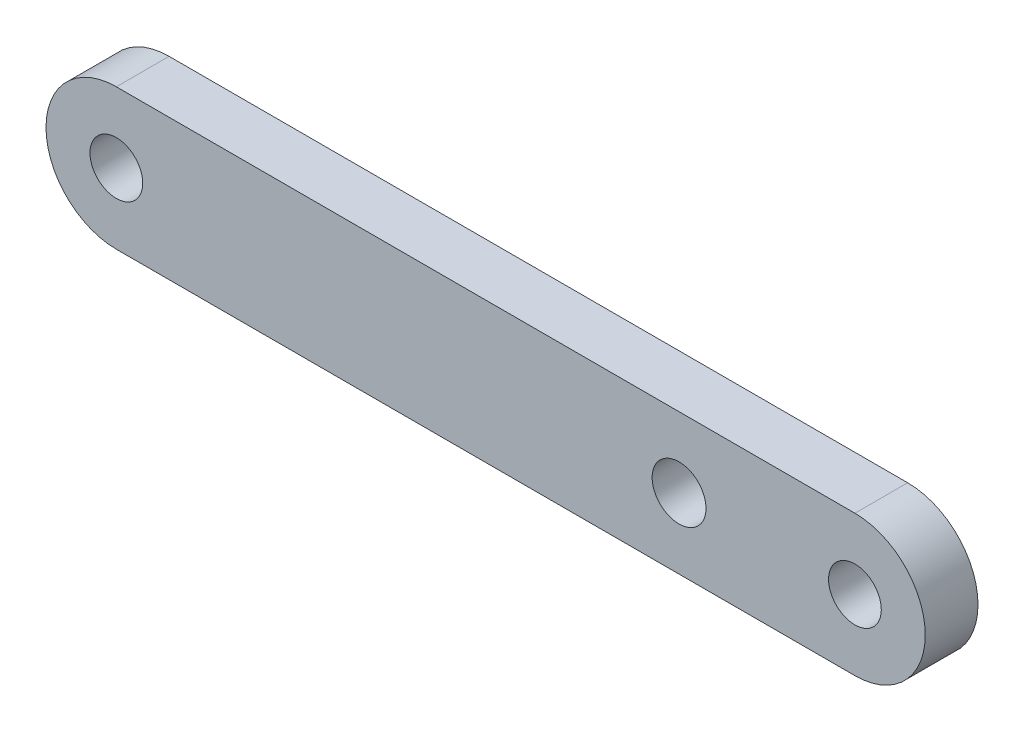
ISO-10303-21;
HEADER;
FILE_DESCRIPTION(('STEP AP214'),'2;1');
FILE_NAME('part.step','',(''),(''),'','','');
FILE_SCHEMA(('AUTOMOTIVE_DESIGN { 1 0 10303 214 1 1 1 1 }'));
ENDSEC;
DATA;
#1=APPLICATION_CONTEXT('core data for automotive mechanical design processes');
#2=APPLICATION_PROTOCOL_DEFINITION('international standard','automotive_design',2000,#1);
#3=PRODUCT_CONTEXT('',#1,'mechanical');
#4=PRODUCT('Part','Part','',(#3));
#5=PRODUCT_RELATED_PRODUCT_CATEGORY('part','',(#4));
#6=PRODUCT_DEFINITION_FORMATION('','',#4);
#7=PRODUCT_DEFINITION_CONTEXT('part definition',#1,'design');
#8=PRODUCT_DEFINITION('design','',#6,#7);
#9=PRODUCT_DEFINITION_SHAPE('','',#8);
#10=(LENGTH_UNIT() NAMED_UNIT(*) SI_UNIT(.MILLI.,.METRE.));
#11=(NAMED_UNIT(*) PLANE_ANGLE_UNIT() SI_UNIT($,.RADIAN.));
#12=(NAMED_UNIT(*) SI_UNIT($,.STERADIAN.) SOLID_ANGLE_UNIT());
#13=UNCERTAINTY_MEASURE_WITH_UNIT(LENGTH_MEASURE(1.E-05),#10,'distance_accuracy_value','');
#14=(GEOMETRIC_REPRESENTATION_CONTEXT(3) GLOBAL_UNCERTAINTY_ASSIGNED_CONTEXT((#13)) GLOBAL_UNIT_ASSIGNED_CONTEXT((#10,
#11,#12)) REPRESENTATION_CONTEXT('',''));
#15=CARTESIAN_POINT('',(0.,0.,0.));
#16=DIRECTION('',(0.,0.,1.));
#17=DIRECTION('',(1.,0.,0.));
#18=AXIS2_PLACEMENT_3D('',#15,#16,#17);
#19=CARTESIAN_POINT('',(-105.,0.,15.));
#20=DIRECTION('',(0.,0.,-1.));
#21=DIRECTION('',(-1.,0.,0.));
#22=AXIS2_PLACEMENT_3D('',#19,#20,#21);
#23=CYLINDRICAL_SURFACE('',#22,20.);
#24=CARTESIAN_POINT('',(-105.,0.,0.));
#25=DIRECTION('',(0.,0.,1.));
#26=DIRECTION('',(1.,0.,0.));
#27=AXIS2_PLACEMENT_3D('',#24,#25,#26);
#28=CIRCLE('',#27,20.);
#29=CARTESIAN_POINT('',(-105.,20.,0.));
#30=VERTEX_POINT('',#29);
#31=CARTESIAN_POINT('',(-105.,-20.,0.));
#32=VERTEX_POINT('',#31);
#33=EDGE_CURVE('E109',#30,#32,#28,.T.);
#34=ORIENTED_EDGE('',*,*,#33,.T.);
#35=DIRECTION('',(0.,0.,-1.));
#36=VECTOR('',#35,1.);
#37=CARTESIAN_POINT('',(-105.,-20.,15.));
#38=LINE('',#37,#36);
#39=CARTESIAN_POINT('',(-105.,-20.,15.));
#40=VERTEX_POINT('',#39);
#41=EDGE_CURVE('E11',#40,#32,#38,.T.);
#42=ORIENTED_EDGE('',*,*,#41,.F.);
#43=CARTESIAN_POINT('',(-105.,0.,15.));
#44=DIRECTION('',(0.,0.,1.));
#45=DIRECTION('',(1.,0.,0.));
#46=AXIS2_PLACEMENT_3D('',#43,#44,#45);
#47=CIRCLE('',#46,20.);
#48=CARTESIAN_POINT('',(-105.,20.,15.));
#49=VERTEX_POINT('',#48);
#50=EDGE_CURVE('E93',#49,#40,#47,.T.);
#51=ORIENTED_EDGE('',*,*,#50,.F.);
#52=DIRECTION('',(0.,0.,-1.));
#53=VECTOR('',#52,1.);
#54=CARTESIAN_POINT('',(-105.,20.,15.));
#55=LINE('',#54,#53);
#56=EDGE_CURVE('E105',#49,#30,#55,.T.);
#57=ORIENTED_EDGE('',*,*,#56,.T.);
#58=EDGE_LOOP('',(#34,#42,#51,#57));
#59=FACE_BOUND('',#58,.T.);
#60=ADVANCED_FACE('F41',(#59),#23,.T.);
#61=CARTESIAN_POINT('',(-105.,-20.,15.));
#62=DIRECTION('',(0.,1.,0.));
#63=DIRECTION('',(0.,0.,1.));
#64=AXIS2_PLACEMENT_3D('',#61,#62,#63);
#65=PLANE('',#64);
#66=DIRECTION('',(1.,0.,0.));
#67=VECTOR('',#66,1.);
#68=CARTESIAN_POINT('',(-105.,-20.,0.));
#69=LINE('',#68,#67);
#70=CARTESIAN_POINT('',(105.,-20.,0.));
#71=VERTEX_POINT('',#70);
#72=EDGE_CURVE('E98',#32,#71,#69,.T.);
#73=ORIENTED_EDGE('',*,*,#72,.T.);
#74=DIRECTION('',(0.,0.,-1.));
#75=VECTOR('',#74,1.);
#76=CARTESIAN_POINT('',(105.,-20.,15.));
#77=LINE('',#76,#75);
#78=CARTESIAN_POINT('',(105.,-20.,15.));
#79=VERTEX_POINT('',#78);
#80=EDGE_CURVE('E50',#79,#71,#77,.T.);
#81=ORIENTED_EDGE('',*,*,#80,.F.);
#82=DIRECTION('',(1.,0.,0.));
#83=VECTOR('',#82,1.);
#84=CARTESIAN_POINT('',(-105.,-20.,15.));
#85=LINE('',#84,#83);
#86=EDGE_CURVE('E88',#40,#79,#85,.T.);
#87=ORIENTED_EDGE('',*,*,#86,.F.);
#88=ORIENTED_EDGE('',*,*,#41,.T.);
#89=EDGE_LOOP('',(#73,#81,#87,#88));
#90=FACE_BOUND('',#89,.T.);
#91=ADVANCED_FACE('F97',(#90),#65,.F.);
#92=CARTESIAN_POINT('',(105.,0.,15.));
#93=DIRECTION('',(0.,0.,-1.));
#94=DIRECTION('',(-1.,0.,0.));
#95=AXIS2_PLACEMENT_3D('',#92,#93,#94);
#96=CYLINDRICAL_SURFACE('',#95,20.);
#97=CARTESIAN_POINT('',(105.,0.,0.));
#98=DIRECTION('',(0.,0.,1.));
#99=DIRECTION('',(-1.,0.,0.));
#100=AXIS2_PLACEMENT_3D('',#97,#98,#99);
#101=CIRCLE('',#100,20.);
#102=CARTESIAN_POINT('',(105.,20.,0.));
#103=VERTEX_POINT('',#102);
#104=EDGE_CURVE('E75',#71,#103,#101,.T.);
#105=ORIENTED_EDGE('',*,*,#104,.T.);
#106=DIRECTION('',(0.,0.,-1.));
#107=VECTOR('',#106,1.);
#108=CARTESIAN_POINT('',(105.,20.,15.));
#109=LINE('',#108,#107);
#110=CARTESIAN_POINT('',(105.,20.,15.));
#111=VERTEX_POINT('',#110);
#112=EDGE_CURVE('E100',#111,#103,#109,.T.);
#113=ORIENTED_EDGE('',*,*,#112,.F.);
#114=CARTESIAN_POINT('',(105.,0.,15.));
#115=DIRECTION('',(0.,0.,1.));
#116=DIRECTION('',(-1.,0.,0.));
#117=AXIS2_PLACEMENT_3D('',#114,#115,#116);
#118=CIRCLE('',#117,20.);
#119=EDGE_CURVE('E91',#79,#111,#118,.T.);
#120=ORIENTED_EDGE('',*,*,#119,.F.);
#121=ORIENTED_EDGE('',*,*,#80,.T.);
#122=EDGE_LOOP('',(#105,#113,#120,#121));
#123=FACE_BOUND('',#122,.T.);
#124=ADVANCED_FACE('F101',(#123),#96,.T.);
#125=CARTESIAN_POINT('',(-105.,20.,15.));
#126=DIRECTION('',(0.,-1.,0.));
#127=DIRECTION('',(0.,0.,-1.));
#128=AXIS2_PLACEMENT_3D('',#125,#126,#127);
#129=PLANE('',#128);
#130=DIRECTION('',(-1.,0.,0.));
#131=VECTOR('',#130,1.);
#132=CARTESIAN_POINT('',(-105.,20.,0.));
#133=LINE('',#132,#131);
#134=EDGE_CURVE('E81',#103,#30,#133,.T.);
#135=ORIENTED_EDGE('',*,*,#134,.T.);
#136=ORIENTED_EDGE('',*,*,#56,.F.);
#137=DIRECTION('',(-1.,0.,0.));
#138=VECTOR('',#137,1.);
#139=CARTESIAN_POINT('',(-105.,20.,15.));
#140=LINE('',#139,#138);
#141=EDGE_CURVE('E58',#111,#49,#140,.T.);
#142=ORIENTED_EDGE('',*,*,#141,.F.);
#143=ORIENTED_EDGE('',*,*,#112,.T.);
#144=EDGE_LOOP('',(#135,#136,#142,#143));
#145=FACE_BOUND('',#144,.T.);
#146=ADVANCED_FACE('F123',(#145),#129,.F.);
#147=CARTESIAN_POINT('',(-105.,0.,15.));
#148=DIRECTION('',(0.,0.,1.));
#149=DIRECTION('',(1.,0.,0.));
#150=AXIS2_PLACEMENT_3D('',#147,#148,#149);
#151=PLANE('',#150);
#152=CARTESIAN_POINT('',(55.,0.,15.));
#153=DIRECTION('',(0.,0.,1.));
#154=DIRECTION('',(1.,0.,0.));
#155=AXIS2_PLACEMENT_3D('',#152,#153,#154);
#156=CIRCLE('',#155,7.6562877612867);
#157=CARTESIAN_POINT('',(62.6562877612867,0.,15.));
#158=VERTEX_POINT('',#157);
#159=EDGE_CURVE('E146',#158,#158,#156,.T.);
#160=ORIENTED_EDGE('',*,*,#159,.F.);
#161=EDGE_LOOP('',(#160));
#162=FACE_BOUND('',#161,.T.);
#163=CARTESIAN_POINT('',(-105.,0.,15.));
#164=DIRECTION('',(0.,0.,-1.));
#165=DIRECTION('',(-1.,0.,0.));
#166=AXIS2_PLACEMENT_3D('',#163,#164,#165);
#167=CIRCLE('',#166,7.5);
#168=CARTESIAN_POINT('',(-112.5,0.,15.));
#169=VERTEX_POINT('',#168);
#170=EDGE_CURVE('E138',#169,#169,#167,.T.);
#171=ORIENTED_EDGE('',*,*,#170,.T.);
#172=EDGE_LOOP('',(#171));
#173=FACE_BOUND('',#172,.T.);
#174=CARTESIAN_POINT('',(105.,0.,15.));
#175=DIRECTION('',(0.,0.,1.));
#176=DIRECTION('',(1.,0.,0.));
#177=AXIS2_PLACEMENT_3D('',#174,#175,#176);
#178=CIRCLE('',#177,7.5);
#179=CARTESIAN_POINT('',(112.5,0.,15.));
#180=VERTEX_POINT('',#179);
#181=EDGE_CURVE('E130',#180,#180,#178,.T.);
#182=ORIENTED_EDGE('',*,*,#181,.F.);
#183=EDGE_LOOP('',(#182));
#184=FACE_BOUND('',#183,.T.);
#185=ORIENTED_EDGE('',*,*,#50,.T.);
#186=ORIENTED_EDGE('',*,*,#86,.T.);
#187=ORIENTED_EDGE('',*,*,#119,.T.);
#188=ORIENTED_EDGE('',*,*,#141,.T.);
#189=EDGE_LOOP('',(#185,#186,#187,#188));
#190=FACE_BOUND('',#189,.T.);
#191=ADVANCED_FACE('F89',(#162,#173,#184,#190),#151,.T.);
#192=CARTESIAN_POINT('',(-105.,0.,0.));
#193=DIRECTION('',(0.,0.,1.));
#194=DIRECTION('',(1.,0.,0.));
#195=AXIS2_PLACEMENT_3D('',#192,#193,#194);
#196=PLANE('',#195);
#197=CARTESIAN_POINT('',(55.,0.,0.));
#198=DIRECTION('',(0.,0.,1.));
#199=DIRECTION('',(1.,0.,0.));
#200=AXIS2_PLACEMENT_3D('',#197,#198,#199);
#201=CIRCLE('',#200,7.6562877612867);
#202=CARTESIAN_POINT('',(62.6562877612867,0.,0.));
#203=VERTEX_POINT('',#202);
#204=EDGE_CURVE('E142',#203,#203,#201,.T.);
#205=ORIENTED_EDGE('',*,*,#204,.T.);
#206=EDGE_LOOP('',(#205));
#207=FACE_BOUND('',#206,.T.);
#208=CARTESIAN_POINT('',(-105.,0.,0.));
#209=DIRECTION('',(0.,0.,-1.));
#210=DIRECTION('',(-1.,0.,0.));
#211=AXIS2_PLACEMENT_3D('',#208,#209,#210);
#212=CIRCLE('',#211,7.5);
#213=CARTESIAN_POINT('',(-112.5,0.,0.));
#214=VERTEX_POINT('',#213);
#215=EDGE_CURVE('E134',#214,#214,#212,.T.);
#216=ORIENTED_EDGE('',*,*,#215,.F.);
#217=EDGE_LOOP('',(#216));
#218=FACE_BOUND('',#217,.T.);
#219=CARTESIAN_POINT('',(105.,0.,0.));
#220=DIRECTION('',(0.,0.,1.));
#221=DIRECTION('',(1.,0.,0.));
#222=AXIS2_PLACEMENT_3D('',#219,#220,#221);
#223=CIRCLE('',#222,7.5);
#224=CARTESIAN_POINT('',(112.5,0.,0.));
#225=VERTEX_POINT('',#224);
#226=EDGE_CURVE('E113',#225,#225,#223,.T.);
#227=ORIENTED_EDGE('',*,*,#226,.T.);
#228=EDGE_LOOP('',(#227));
#229=FACE_BOUND('',#228,.T.);
#230=ORIENTED_EDGE('',*,*,#33,.F.);
#231=ORIENTED_EDGE('',*,*,#134,.F.);
#232=ORIENTED_EDGE('',*,*,#104,.F.);
#233=ORIENTED_EDGE('',*,*,#72,.F.);
#234=EDGE_LOOP('',(#230,#231,#232,#233));
#235=FACE_BOUND('',#234,.T.);
#236=ADVANCED_FACE('F126',(#207,#218,#229,#235),#196,.F.);
#237=CARTESIAN_POINT('',(105.,0.,0.));
#238=DIRECTION('',(0.,0.,1.));
#239=DIRECTION('',(1.,0.,0.));
#240=AXIS2_PLACEMENT_3D('',#237,#238,#239);
#241=CYLINDRICAL_SURFACE('',#240,7.5);
#242=ORIENTED_EDGE('',*,*,#226,.F.);
#243=EDGE_LOOP('',(#242));
#244=FACE_BOUND('',#243,.T.);
#245=ORIENTED_EDGE('',*,*,#181,.T.);
#246=EDGE_LOOP('',(#245));
#247=FACE_BOUND('',#246,.T.);
#248=ADVANCED_FACE('F170',(#244,#247),#241,.F.);
#249=CARTESIAN_POINT('',(-105.,0.,0.));
#250=DIRECTION('',(0.,0.,1.));
#251=DIRECTION('',(1.,0.,0.));
#252=AXIS2_PLACEMENT_3D('',#249,#250,#251);
#253=CYLINDRICAL_SURFACE('',#252,7.5);
#254=ORIENTED_EDGE('',*,*,#215,.T.);
#255=EDGE_LOOP('',(#254));
#256=FACE_BOUND('',#255,.T.);
#257=ORIENTED_EDGE('',*,*,#170,.F.);
#258=EDGE_LOOP('',(#257));
#259=FACE_BOUND('',#258,.T.);
#260=ADVANCED_FACE('F159',(#256,#259),#253,.F.);
#261=CARTESIAN_POINT('',(55.,0.,0.));
#262=DIRECTION('',(0.,0.,1.));
#263=DIRECTION('',(1.,0.,0.));
#264=AXIS2_PLACEMENT_3D('',#261,#262,#263);
#265=CYLINDRICAL_SURFACE('',#264,7.6562877612867);
#266=ORIENTED_EDGE('',*,*,#204,.F.);
#267=EDGE_LOOP('',(#266));
#268=FACE_BOUND('',#267,.T.);
#269=ORIENTED_EDGE('',*,*,#159,.T.);
#270=EDGE_LOOP('',(#269));
#271=FACE_BOUND('',#270,.T.);
#272=ADVANCED_FACE('F156',(#268,#271),#265,.F.);
#273=CLOSED_SHELL('',(#60,#91,#124,#146,#191,#236,#248,#260,#272));
#274=MANIFOLD_SOLID_BREP('B2',#273);
#275=ADVANCED_BREP_SHAPE_REPRESENTATION('',(#18,#274),#14);
#276=SHAPE_DEFINITION_REPRESENTATION(#9,#275);
ENDSEC;
END-ISO-10303-21;
